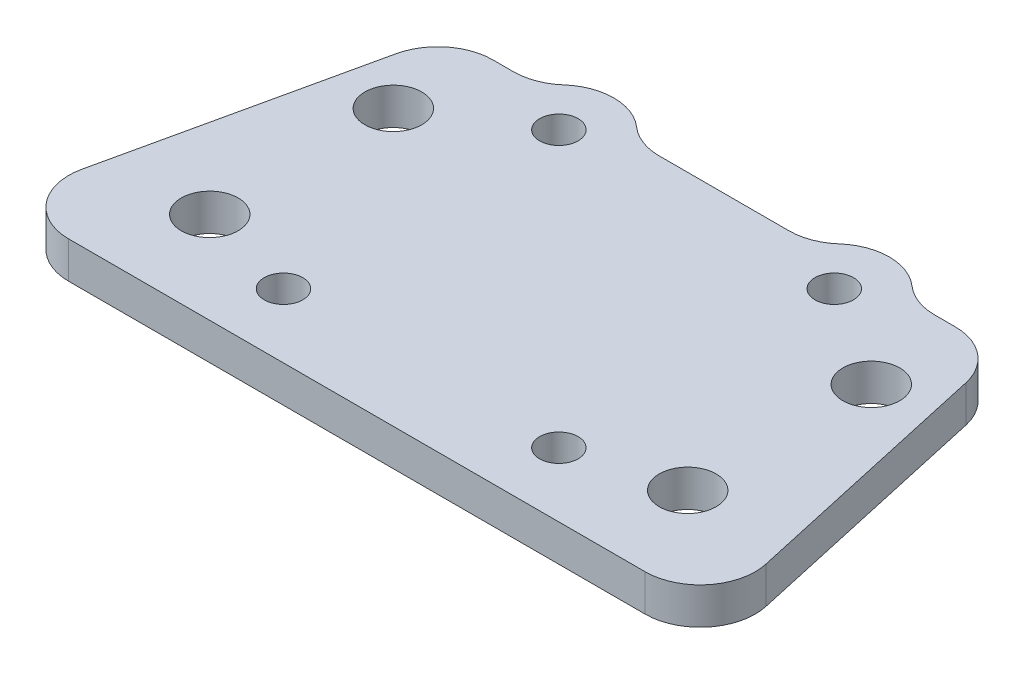
ISO-10303-21;
HEADER;
FILE_DESCRIPTION(('STEP AP214'),'2;1');
FILE_NAME('part.step','',(''),(''),'','','');
FILE_SCHEMA(('AUTOMOTIVE_DESIGN { 1 0 10303 214 1 1 1 1 }'));
ENDSEC;
DATA;
#1=APPLICATION_CONTEXT('core data for automotive mechanical design processes');
#2=APPLICATION_PROTOCOL_DEFINITION('international standard','automotive_design',2000,#1);
#3=PRODUCT_CONTEXT('',#1,'mechanical');
#4=PRODUCT('Part','Part','',(#3));
#5=PRODUCT_RELATED_PRODUCT_CATEGORY('part','',(#4));
#6=PRODUCT_DEFINITION_FORMATION('','',#4);
#7=PRODUCT_DEFINITION_CONTEXT('part definition',#1,'design');
#8=PRODUCT_DEFINITION('design','',#6,#7);
#9=PRODUCT_DEFINITION_SHAPE('','',#8);
#10=(LENGTH_UNIT() NAMED_UNIT(*) SI_UNIT(.MILLI.,.METRE.));
#11=(NAMED_UNIT(*) PLANE_ANGLE_UNIT() SI_UNIT($,.RADIAN.));
#12=(NAMED_UNIT(*) SI_UNIT($,.STERADIAN.) SOLID_ANGLE_UNIT());
#13=UNCERTAINTY_MEASURE_WITH_UNIT(LENGTH_MEASURE(1.E-05),#10,'distance_accuracy_value','');
#14=(GEOMETRIC_REPRESENTATION_CONTEXT(3) GLOBAL_UNCERTAINTY_ASSIGNED_CONTEXT((#13)) GLOBAL_UNIT_ASSIGNED_CONTEXT((#10,
#11,#12)) REPRESENTATION_CONTEXT('',''));
#15=CARTESIAN_POINT('',(0.,0.,0.));
#16=DIRECTION('',(0.,0.,1.));
#17=DIRECTION('',(1.,0.,0.));
#18=AXIS2_PLACEMENT_3D('',#15,#16,#17);
#19=CARTESIAN_POINT('',(0.,2.,-10.));
#20=DIRECTION('',(0.,0.,1.));
#21=DIRECTION('',(1.,0.,0.));
#22=AXIS2_PLACEMENT_3D('',#19,#20,#21);
#23=PLANE('',#22);
#24=DIRECTION('',(-1.,0.,0.));
#25=VECTOR('',#24,1.);
#26=CARTESIAN_POINT('',(0.,2.,-10.));
#27=LINE('',#26,#25);
#28=CARTESIAN_POINT('',(3.53137303340311,2.,-10.));
#29=VERTEX_POINT('',#28);
#30=CARTESIAN_POINT('',(-3.53137303340312,2.,-10.));
#31=VERTEX_POINT('',#30);
#32=EDGE_CURVE('E194',#29,#31,#27,.T.);
#33=ORIENTED_EDGE('',*,*,#32,.F.);
#34=DIRECTION('',(0.,1.,0.));
#35=VECTOR('',#34,1.);
#36=CARTESIAN_POINT('',(3.53137303340311,2.,-10.));
#37=LINE('',#36,#35);
#38=CARTESIAN_POINT('',(3.53137303340311,0.,-10.));
#39=VERTEX_POINT('',#38);
#40=EDGE_CURVE('E255',#29,#39,#37,.F.);
#41=ORIENTED_EDGE('',*,*,#40,.T.);
#42=DIRECTION('',(-1.,0.,0.));
#43=VECTOR('',#42,1.);
#44=CARTESIAN_POINT('',(0.,0.,-10.));
#45=LINE('',#44,#43);
#46=CARTESIAN_POINT('',(-3.53137303340312,0.,-10.));
#47=VERTEX_POINT('',#46);
#48=EDGE_CURVE('E289',#39,#47,#45,.T.);
#49=ORIENTED_EDGE('',*,*,#48,.T.);
#50=DIRECTION('',(0.,1.,0.));
#51=VECTOR('',#50,1.);
#52=CARTESIAN_POINT('',(-3.53137303340312,2.,-10.));
#53=LINE('',#52,#51);
#54=EDGE_CURVE('E251',#47,#31,#53,.T.);
#55=ORIENTED_EDGE('',*,*,#54,.T.);
#56=EDGE_LOOP('',(#33,#41,#49,#55));
#57=FACE_BOUND('',#56,.T.);
#58=ADVANCED_FACE('F47',(#57),#23,.F.);
#59=CARTESIAN_POINT('',(12.5926904073647,0.,-10.));
#60=VERTEX_POINT('',#59);
#61=CARTESIAN_POINT('',(11.4686269665969,0.,-10.));
#62=VERTEX_POINT('',#61);
#63=EDGE_CURVE('E164',#60,#62,#45,.T.);
#64=ORIENTED_EDGE('',*,*,#63,.T.);
#65=DIRECTION('',(0.,1.,0.));
#66=VECTOR('',#65,1.);
#67=CARTESIAN_POINT('',(11.4686269665969,2.,-10.));
#68=LINE('',#67,#66);
#69=CARTESIAN_POINT('',(11.4686269665969,2.,-10.));
#70=VERTEX_POINT('',#69);
#71=EDGE_CURVE('E240',#62,#70,#68,.T.);
#72=ORIENTED_EDGE('',*,*,#71,.T.);
#73=CARTESIAN_POINT('',(12.5926904073647,2.,-10.));
#74=VERTEX_POINT('',#73);
#75=EDGE_CURVE('E188',#74,#70,#27,.T.);
#76=ORIENTED_EDGE('',*,*,#75,.F.);
#77=DIRECTION('',(0.,-1.,0.));
#78=VECTOR('',#77,1.);
#79=CARTESIAN_POINT('',(12.5926904073647,0.,-10.));
#80=LINE('',#79,#78);
#81=EDGE_CURVE('E233',#74,#60,#80,.T.);
#82=ORIENTED_EDGE('',*,*,#81,.T.);
#83=EDGE_LOOP('',(#64,#72,#76,#82));
#84=FACE_BOUND('',#83,.T.);
#85=ADVANCED_FACE('F433',(#84),#23,.F.);
#86=CARTESIAN_POINT('',(-16.410890604518,2.,-3.6413136365179));
#87=DIRECTION('',(0.976256937653027,0.,0.216615769703717));
#88=DIRECTION('',(0.216615769703717,0.,-0.976256937653027));
#89=AXIS2_PLACEMENT_3D('',#86,#87,#88);
#90=PLANE('',#89);
#91=DIRECTION('',(-0.216615769703717,0.,0.976256937653027));
#92=VECTOR('',#91,1.);
#93=CARTESIAN_POINT('',(-16.410890604518,0.,-3.6413136365179));
#94=LINE('',#93,#92);
#95=CARTESIAN_POINT('',(-15.5214612203238,0.,-7.64984730911115));
#96=VERTEX_POINT('',#95);
#97=CARTESIAN_POINT('',(-18.6278368668238,0.,6.35015269088885));
#98=VERTEX_POINT('',#97);
#99=EDGE_CURVE('E383',#96,#98,#94,.T.);
#100=ORIENTED_EDGE('',*,*,#99,.T.);
#101=DIRECTION('',(0.,-1.,0.));
#102=VECTOR('',#101,1.);
#103=CARTESIAN_POINT('',(-18.6278368668238,2.,6.35015269088885));
#104=LINE('',#103,#102);
#105=CARTESIAN_POINT('',(-18.6278368668238,2.,6.35015269088885));
#106=VERTEX_POINT('',#105);
#107=EDGE_CURVE('E230',#98,#106,#104,.F.);
#108=ORIENTED_EDGE('',*,*,#107,.T.);
#109=DIRECTION('',(-0.216615769703717,0.,0.976256937653027));
#110=VECTOR('',#109,1.);
#111=CARTESIAN_POINT('',(-16.410890604518,2.,-3.6413136365179));
#112=LINE('',#111,#110);
#113=CARTESIAN_POINT('',(-15.5214612203238,2.,-7.64984730911115));
#114=VERTEX_POINT('',#113);
#115=EDGE_CURVE('E387',#114,#106,#112,.T.);
#116=ORIENTED_EDGE('',*,*,#115,.F.);
#117=DIRECTION('',(0.,-1.,0.));
#118=VECTOR('',#117,1.);
#119=CARTESIAN_POINT('',(-15.5214612203238,2.,-7.64984730911115));
#120=LINE('',#119,#118);
#121=EDGE_CURVE('E226',#114,#96,#120,.T.);
#122=ORIENTED_EDGE('',*,*,#121,.T.);
#123=EDGE_LOOP('',(#100,#108,#116,#122));
#124=FACE_BOUND('',#123,.T.);
#125=ADVANCED_FACE('F417',(#124),#90,.F.);
#126=CARTESIAN_POINT('',(0.,2.,10.));
#127=DIRECTION('',(0.,0.,-1.));
#128=DIRECTION('',(-1.,0.,0.));
#129=AXIS2_PLACEMENT_3D('',#126,#127,#128);
#130=PLANE('',#129);
#131=DIRECTION('',(1.,0.,0.));
#132=VECTOR('',#131,1.);
#133=CARTESIAN_POINT('',(0.,0.,10.));
#134=LINE('',#133,#132);
#135=CARTESIAN_POINT('',(-15.6990660538648,0.,10.));
#136=VERTEX_POINT('',#135);
#137=CARTESIAN_POINT('',(15.6990660538647,0.,10.));
#138=VERTEX_POINT('',#137);
#139=EDGE_CURVE('E182',#136,#138,#134,.T.);
#140=ORIENTED_EDGE('',*,*,#139,.T.);
#141=DIRECTION('',(0.,-1.,0.));
#142=VECTOR('',#141,1.);
#143=CARTESIAN_POINT('',(15.6990660538647,2.,10.));
#144=LINE('',#143,#142);
#145=CARTESIAN_POINT('',(15.6990660538647,2.,10.));
#146=VERTEX_POINT('',#145);
#147=EDGE_CURVE('E212',#138,#146,#144,.F.);
#148=ORIENTED_EDGE('',*,*,#147,.T.);
#149=DIRECTION('',(1.,0.,0.));
#150=VECTOR('',#149,1.);
#151=CARTESIAN_POINT('',(0.,2.,10.));
#152=LINE('',#151,#150);
#153=CARTESIAN_POINT('',(-15.6990660538648,2.,10.));
#154=VERTEX_POINT('',#153);
#155=EDGE_CURVE('E391',#154,#146,#152,.T.);
#156=ORIENTED_EDGE('',*,*,#155,.F.);
#157=DIRECTION('',(0.,-1.,0.));
#158=VECTOR('',#157,1.);
#159=CARTESIAN_POINT('',(-15.6990660538648,2.,10.));
#160=LINE('',#159,#158);
#161=EDGE_CURVE('E208',#154,#136,#160,.T.);
#162=ORIENTED_EDGE('',*,*,#161,.T.);
#163=EDGE_LOOP('',(#140,#148,#156,#162));
#164=FACE_BOUND('',#163,.T.);
#165=ADVANCED_FACE('F405',(#164),#130,.F.);
#166=CARTESIAN_POINT('',(16.410890604518,2.,-3.64131363651789));
#167=DIRECTION('',(0.976256937653027,0.,-0.216615769703717));
#168=DIRECTION('',(-0.216615769703717,0.,-0.976256937653027));
#169=AXIS2_PLACEMENT_3D('',#166,#167,#168);
#170=PLANE('',#169);
#171=DIRECTION('',(0.216615769703717,0.,0.976256937653027));
#172=VECTOR('',#171,1.);
#173=CARTESIAN_POINT('',(16.410890604518,2.,-3.64131363651789));
#174=LINE('',#173,#172);
#175=CARTESIAN_POINT('',(15.5214612203238,2.,-7.64984730911115));
#176=VERTEX_POINT('',#175);
#177=CARTESIAN_POINT('',(18.6278368668238,2.,6.35015269088885));
#178=VERTEX_POINT('',#177);
#179=EDGE_CURVE('E394',#176,#178,#174,.T.);
#180=ORIENTED_EDGE('',*,*,#179,.T.);
#181=DIRECTION('',(0.,-1.,0.));
#182=VECTOR('',#181,1.);
#183=CARTESIAN_POINT('',(18.6278368668238,0.,6.35015269088885));
#184=LINE('',#183,#182);
#185=CARTESIAN_POINT('',(18.6278368668238,0.,6.35015269088885));
#186=VERTEX_POINT('',#185);
#187=EDGE_CURVE('E171',#178,#186,#184,.T.);
#188=ORIENTED_EDGE('',*,*,#187,.T.);
#189=DIRECTION('',(0.216615769703717,0.,0.976256937653027));
#190=VECTOR('',#189,1.);
#191=CARTESIAN_POINT('',(16.410890604518,0.,-3.64131363651789));
#192=LINE('',#191,#190);
#193=CARTESIAN_POINT('',(15.5214612203238,0.,-7.64984730911115));
#194=VERTEX_POINT('',#193);
#195=EDGE_CURVE('E162',#194,#186,#192,.T.);
#196=ORIENTED_EDGE('',*,*,#195,.F.);
#197=DIRECTION('',(0.,-1.,0.));
#198=VECTOR('',#197,1.);
#199=CARTESIAN_POINT('',(15.5214612203238,2.,-7.64984730911115));
#200=LINE('',#199,#198);
#201=EDGE_CURVE('E177',#194,#176,#200,.F.);
#202=ORIENTED_EDGE('',*,*,#201,.T.);
#203=EDGE_LOOP('',(#180,#188,#196,#202));
#204=FACE_BOUND('',#203,.T.);
#205=ADVANCED_FACE('F176',(#204),#170,.T.);
#206=CARTESIAN_POINT('',(-11.4686269665969,2.,-10.));
#207=VERTEX_POINT('',#206);
#208=CARTESIAN_POINT('',(-12.5926904073647,2.,-10.));
#209=VERTEX_POINT('',#208);
#210=EDGE_CURVE('E196',#207,#209,#27,.T.);
#211=ORIENTED_EDGE('',*,*,#210,.F.);
#212=DIRECTION('',(0.,1.,0.));
#213=VECTOR('',#212,1.);
#214=CARTESIAN_POINT('',(-11.4686269665969,2.,-10.));
#215=LINE('',#214,#213);
#216=CARTESIAN_POINT('',(-11.4686269665969,0.,-10.));
#217=VERTEX_POINT('',#216);
#218=EDGE_CURVE('E63',#207,#217,#215,.F.);
#219=ORIENTED_EDGE('',*,*,#218,.T.);
#220=CARTESIAN_POINT('',(-12.5926904073647,0.,-10.));
#221=VERTEX_POINT('',#220);
#222=EDGE_CURVE('E181',#217,#221,#45,.T.);
#223=ORIENTED_EDGE('',*,*,#222,.T.);
#224=DIRECTION('',(0.,-1.,0.));
#225=VECTOR('',#224,1.);
#226=CARTESIAN_POINT('',(-12.5926904073647,2.,-10.));
#227=LINE('',#226,#225);
#228=EDGE_CURVE('E236',#221,#209,#227,.F.);
#229=ORIENTED_EDGE('',*,*,#228,.T.);
#230=EDGE_LOOP('',(#211,#219,#223,#229));
#231=FACE_BOUND('',#230,.T.);
#232=ADVANCED_FACE('F435',(#231),#23,.F.);
#233=CARTESIAN_POINT('',(0.,2.,0.));
#234=DIRECTION('',(0.,1.,0.));
#235=DIRECTION('',(0.,0.,1.));
#236=AXIS2_PLACEMENT_3D('',#233,#234,#235);
#237=PLANE('',#236);
#238=CARTESIAN_POINT('',(7.5,2.,-8.5));
#239=DIRECTION('',(0.,1.,0.));
#240=DIRECTION('',(0.,0.,1.));
#241=AXIS2_PLACEMENT_3D('',#238,#239,#240);
#242=CIRCLE('',#241,1.05);
#243=CARTESIAN_POINT('',(7.5,2.,-7.45));
#244=VERTEX_POINT('',#243);
#245=EDGE_CURVE('E340',#244,#244,#242,.T.);
#246=ORIENTED_EDGE('',*,*,#245,.F.);
#247=EDGE_LOOP('',(#246));
#248=FACE_BOUND('',#247,.T.);
#249=CARTESIAN_POINT('',(7.5,2.,6.5));
#250=DIRECTION('',(0.,1.,0.));
#251=DIRECTION('',(0.,0.,1.));
#252=AXIS2_PLACEMENT_3D('',#249,#250,#251);
#253=CIRCLE('',#252,1.05);
#254=CARTESIAN_POINT('',(7.5,2.,7.55));
#255=VERTEX_POINT('',#254);
#256=EDGE_CURVE('E332',#255,#255,#253,.T.);
#257=ORIENTED_EDGE('',*,*,#256,.F.);
#258=EDGE_LOOP('',(#257));
#259=FACE_BOUND('',#258,.T.);
#260=CARTESIAN_POINT('',(-7.5,2.,6.5));
#261=DIRECTION('',(0.,1.,0.));
#262=DIRECTION('',(0.,0.,1.));
#263=AXIS2_PLACEMENT_3D('',#260,#261,#262);
#264=CIRCLE('',#263,1.05);
#265=CARTESIAN_POINT('',(-7.5,2.,7.55));
#266=VERTEX_POINT('',#265);
#267=EDGE_CURVE('E323',#266,#266,#264,.T.);
#268=ORIENTED_EDGE('',*,*,#267,.F.);
#269=EDGE_LOOP('',(#268));
#270=FACE_BOUND('',#269,.T.);
#271=CARTESIAN_POINT('',(-7.5,2.,-8.5));
#272=DIRECTION('',(0.,1.,0.));
#273=DIRECTION('',(0.,0.,1.));
#274=AXIS2_PLACEMENT_3D('',#271,#272,#273);
#275=CIRCLE('',#274,1.05);
#276=CARTESIAN_POINT('',(-7.5,2.,-7.45));
#277=VERTEX_POINT('',#276);
#278=EDGE_CURVE('E327',#277,#277,#275,.T.);
#279=ORIENTED_EDGE('',*,*,#278,.F.);
#280=EDGE_LOOP('',(#279));
#281=FACE_BOUND('',#280,.T.);
#282=CARTESIAN_POINT('',(13.0180101702094,2.,-5.));
#283=DIRECTION('',(0.,1.,0.));
#284=DIRECTION('',(0.,0.,-1.));
#285=AXIS2_PLACEMENT_3D('',#282,#283,#284);
#286=CIRCLE('',#285,1.55);
#287=CARTESIAN_POINT('',(13.0180101702094,2.,-6.55));
#288=VERTEX_POINT('',#287);
#289=EDGE_CURVE('E372',#288,#288,#286,.T.);
#290=ORIENTED_EDGE('',*,*,#289,.F.);
#291=EDGE_LOOP('',(#290));
#292=FACE_BOUND('',#291,.T.);
#293=CARTESIAN_POINT('',(13.0180101702094,2.,5.));
#294=DIRECTION('',(0.,1.,0.));
#295=DIRECTION('',(0.,0.,-1.));
#296=AXIS2_PLACEMENT_3D('',#293,#294,#295);
#297=CIRCLE('',#296,1.55);
#298=CARTESIAN_POINT('',(13.0180101702094,2.,3.45));
#299=VERTEX_POINT('',#298);
#300=EDGE_CURVE('E364',#299,#299,#297,.T.);
#301=ORIENTED_EDGE('',*,*,#300,.F.);
#302=EDGE_LOOP('',(#301));
#303=FACE_BOUND('',#302,.T.);
#304=CARTESIAN_POINT('',(-13.0180101702094,2.,5.));
#305=DIRECTION('',(0.,1.,0.));
#306=DIRECTION('',(0.,0.,1.));
#307=AXIS2_PLACEMENT_3D('',#304,#305,#306);
#308=CIRCLE('',#307,1.55);
#309=CARTESIAN_POINT('',(-13.0180101702094,2.,6.55));
#310=VERTEX_POINT('',#309);
#311=EDGE_CURVE('E355',#310,#310,#308,.T.);
#312=ORIENTED_EDGE('',*,*,#311,.F.);
#313=EDGE_LOOP('',(#312));
#314=FACE_BOUND('',#313,.T.);
#315=CARTESIAN_POINT('',(-13.0180101702094,2.,-5.));
#316=DIRECTION('',(0.,1.,0.));
#317=DIRECTION('',(0.,0.,1.));
#318=AXIS2_PLACEMENT_3D('',#315,#316,#317);
#319=CIRCLE('',#318,1.55);
#320=CARTESIAN_POINT('',(-13.0180101702094,2.,-3.45));
#321=VERTEX_POINT('',#320);
#322=EDGE_CURVE('E359',#321,#321,#319,.T.);
#323=ORIENTED_EDGE('',*,*,#322,.F.);
#324=EDGE_LOOP('',(#323));
#325=FACE_BOUND('',#324,.T.);
#326=ORIENTED_EDGE('',*,*,#155,.T.);
#327=CARTESIAN_POINT('',(15.6990660538647,2.,7.));
#328=DIRECTION('',(0.,1.,0.));
#329=DIRECTION('',(0.,0.,1.));
#330=AXIS2_PLACEMENT_3D('',#327,#328,#329);
#331=CIRCLE('',#330,3.);
#332=EDGE_CURVE('E223',#146,#178,#331,.T.);
#333=ORIENTED_EDGE('',*,*,#332,.T.);
#334=ORIENTED_EDGE('',*,*,#179,.F.);
#335=CARTESIAN_POINT('',(12.5926904073647,2.,-7.));
#336=DIRECTION('',(0.,1.,0.));
#337=DIRECTION('',(0.,0.,1.));
#338=AXIS2_PLACEMENT_3D('',#335,#336,#337);
#339=CIRCLE('',#338,3.);
#340=EDGE_CURVE('E186',#176,#74,#339,.T.);
#341=ORIENTED_EDGE('',*,*,#340,.T.);
#342=ORIENTED_EDGE('',*,*,#75,.T.);
#343=CARTESIAN_POINT('',(11.4686269665969,2.,-13.));
#344=DIRECTION('',(0.,1.,0.));
#345=DIRECTION('',(0.,0.,1.));
#346=AXIS2_PLACEMENT_3D('',#343,#344,#345);
#347=CIRCLE('',#346,3.);
#348=CARTESIAN_POINT('',(9.48431348329844,2.,-10.75));
#349=VERTEX_POINT('',#348);
#350=EDGE_CURVE('E267',#70,#349,#347,.F.);
#351=ORIENTED_EDGE('',*,*,#350,.T.);
#352=CARTESIAN_POINT('',(7.5,2.,-8.5));
#353=DIRECTION('',(0.,1.,0.));
#354=DIRECTION('',(0.,0.,1.));
#355=AXIS2_PLACEMENT_3D('',#352,#353,#354);
#356=CIRCLE('',#355,3.);
#357=CARTESIAN_POINT('',(5.51568651670155,2.,-10.75));
#358=VERTEX_POINT('',#357);
#359=EDGE_CURVE('E317',#349,#358,#356,.T.);
#360=ORIENTED_EDGE('',*,*,#359,.T.);
#361=CARTESIAN_POINT('',(3.53137303340311,2.,-13.));
#362=DIRECTION('',(0.,1.,0.));
#363=DIRECTION('',(0.,0.,1.));
#364=AXIS2_PLACEMENT_3D('',#361,#362,#363);
#365=CIRCLE('',#364,3.);
#366=EDGE_CURVE('E273',#358,#29,#365,.F.);
#367=ORIENTED_EDGE('',*,*,#366,.T.);
#368=ORIENTED_EDGE('',*,*,#32,.T.);
#369=CARTESIAN_POINT('',(-3.53137303340312,2.,-13.));
#370=DIRECTION('',(0.,1.,0.));
#371=DIRECTION('',(0.,0.,1.));
#372=AXIS2_PLACEMENT_3D('',#369,#370,#371);
#373=CIRCLE('',#372,3.);
#374=CARTESIAN_POINT('',(-5.51568651670156,2.,-10.75));
#375=VERTEX_POINT('',#374);
#376=EDGE_CURVE('E279',#31,#375,#373,.F.);
#377=ORIENTED_EDGE('',*,*,#376,.T.);
#378=CARTESIAN_POINT('',(-7.5,2.,-8.5));
#379=DIRECTION('',(0.,1.,0.));
#380=DIRECTION('',(0.,0.,1.));
#381=AXIS2_PLACEMENT_3D('',#378,#379,#380);
#382=CIRCLE('',#381,3.);
#383=CARTESIAN_POINT('',(-9.48431348329844,2.,-10.75));
#384=VERTEX_POINT('',#383);
#385=EDGE_CURVE('E305',#375,#384,#382,.T.);
#386=ORIENTED_EDGE('',*,*,#385,.T.);
#387=CARTESIAN_POINT('',(-11.4686269665969,2.,-13.));
#388=DIRECTION('',(0.,1.,0.));
#389=DIRECTION('',(0.,0.,1.));
#390=AXIS2_PLACEMENT_3D('',#387,#388,#389);
#391=CIRCLE('',#390,3.);
#392=EDGE_CURVE('E56',#384,#207,#391,.F.);
#393=ORIENTED_EDGE('',*,*,#392,.T.);
#394=ORIENTED_EDGE('',*,*,#210,.T.);
#395=CARTESIAN_POINT('',(-12.5926904073647,2.,-7.));
#396=DIRECTION('',(0.,1.,0.));
#397=DIRECTION('',(0.,0.,1.));
#398=AXIS2_PLACEMENT_3D('',#395,#396,#397);
#399=CIRCLE('',#398,3.);
#400=EDGE_CURVE('E217',#209,#114,#399,.T.);
#401=ORIENTED_EDGE('',*,*,#400,.T.);
#402=ORIENTED_EDGE('',*,*,#115,.T.);
#403=CARTESIAN_POINT('',(-15.6990660538648,2.,7.));
#404=DIRECTION('',(0.,1.,0.));
#405=DIRECTION('',(0.,0.,1.));
#406=AXIS2_PLACEMENT_3D('',#403,#404,#405);
#407=CIRCLE('',#406,3.);
#408=EDGE_CURVE('E220',#106,#154,#407,.T.);
#409=ORIENTED_EDGE('',*,*,#408,.T.);
#410=EDGE_LOOP('',(#326,#333,#334,#341,#342,#351,#360,#367,#368,#377,#386,#393,#394,#401,#402,#409));
#411=FACE_BOUND('',#410,.T.);
#412=ADVANCED_FACE('F304',(#248,#259,#270,#281,#292,#303,#314,#325,#411),#237,.T.);
#413=CARTESIAN_POINT('',(0.,0.,0.));
#414=DIRECTION('',(0.,1.,0.));
#415=DIRECTION('',(0.,0.,1.));
#416=AXIS2_PLACEMENT_3D('',#413,#414,#415);
#417=PLANE('',#416);
#418=CARTESIAN_POINT('',(7.5,0.,-8.5));
#419=DIRECTION('',(0.,1.,0.));
#420=DIRECTION('',(0.,0.,1.));
#421=AXIS2_PLACEMENT_3D('',#418,#419,#420);
#422=CIRCLE('',#421,1.05);
#423=CARTESIAN_POINT('',(7.5,0.,-7.45));
#424=VERTEX_POINT('',#423);
#425=EDGE_CURVE('E314',#424,#424,#422,.T.);
#426=ORIENTED_EDGE('',*,*,#425,.T.);
#427=EDGE_LOOP('',(#426));
#428=FACE_BOUND('',#427,.T.);
#429=CARTESIAN_POINT('',(7.5,0.,6.5));
#430=DIRECTION('',(0.,1.,0.));
#431=DIRECTION('',(0.,0.,1.));
#432=AXIS2_PLACEMENT_3D('',#429,#430,#431);
#433=CIRCLE('',#432,1.05);
#434=CARTESIAN_POINT('',(7.5,0.,7.55));
#435=VERTEX_POINT('',#434);
#436=EDGE_CURVE('E336',#435,#435,#433,.T.);
#437=ORIENTED_EDGE('',*,*,#436,.T.);
#438=EDGE_LOOP('',(#437));
#439=FACE_BOUND('',#438,.T.);
#440=CARTESIAN_POINT('',(-7.5,0.,6.5));
#441=DIRECTION('',(0.,1.,0.));
#442=DIRECTION('',(0.,0.,1.));
#443=AXIS2_PLACEMENT_3D('',#440,#441,#442);
#444=CIRCLE('',#443,1.05);
#445=CARTESIAN_POINT('',(-7.5,0.,7.55));
#446=VERTEX_POINT('',#445);
#447=EDGE_CURVE('E328',#446,#446,#444,.T.);
#448=ORIENTED_EDGE('',*,*,#447,.T.);
#449=EDGE_LOOP('',(#448));
#450=FACE_BOUND('',#449,.T.);
#451=CARTESIAN_POINT('',(-7.5,0.,-8.5));
#452=DIRECTION('',(0.,1.,0.));
#453=DIRECTION('',(0.,0.,1.));
#454=AXIS2_PLACEMENT_3D('',#451,#452,#453);
#455=CIRCLE('',#454,1.05);
#456=CARTESIAN_POINT('',(-7.5,0.,-7.45));
#457=VERTEX_POINT('',#456);
#458=EDGE_CURVE('E347',#457,#457,#455,.T.);
#459=ORIENTED_EDGE('',*,*,#458,.T.);
#460=EDGE_LOOP('',(#459));
#461=FACE_BOUND('',#460,.T.);
#462=CARTESIAN_POINT('',(13.0180101702094,0.,-5.));
#463=DIRECTION('',(0.,1.,0.));
#464=DIRECTION('',(0.,0.,-1.));
#465=AXIS2_PLACEMENT_3D('',#462,#463,#464);
#466=CIRCLE('',#465,1.55);
#467=CARTESIAN_POINT('',(13.0180101702094,0.,-6.55));
#468=VERTEX_POINT('',#467);
#469=EDGE_CURVE('E351',#468,#468,#466,.T.);
#470=ORIENTED_EDGE('',*,*,#469,.T.);
#471=EDGE_LOOP('',(#470));
#472=FACE_BOUND('',#471,.T.);
#473=CARTESIAN_POINT('',(13.0180101702094,0.,5.));
#474=DIRECTION('',(0.,1.,0.));
#475=DIRECTION('',(0.,0.,-1.));
#476=AXIS2_PLACEMENT_3D('',#473,#474,#475);
#477=CIRCLE('',#476,1.55);
#478=CARTESIAN_POINT('',(13.0180101702094,0.,3.45));
#479=VERTEX_POINT('',#478);
#480=EDGE_CURVE('E368',#479,#479,#477,.T.);
#481=ORIENTED_EDGE('',*,*,#480,.T.);
#482=EDGE_LOOP('',(#481));
#483=FACE_BOUND('',#482,.T.);
#484=CARTESIAN_POINT('',(-13.0180101702094,0.,5.));
#485=DIRECTION('',(0.,1.,0.));
#486=DIRECTION('',(0.,0.,1.));
#487=AXIS2_PLACEMENT_3D('',#484,#485,#486);
#488=CIRCLE('',#487,1.55);
#489=CARTESIAN_POINT('',(-13.0180101702094,0.,6.55));
#490=VERTEX_POINT('',#489);
#491=EDGE_CURVE('E360',#490,#490,#488,.T.);
#492=ORIENTED_EDGE('',*,*,#491,.T.);
#493=EDGE_LOOP('',(#492));
#494=FACE_BOUND('',#493,.T.);
#495=CARTESIAN_POINT('',(-13.0180101702094,0.,-5.));
#496=DIRECTION('',(0.,1.,0.));
#497=DIRECTION('',(0.,0.,1.));
#498=AXIS2_PLACEMENT_3D('',#495,#496,#497);
#499=CIRCLE('',#498,1.55);
#500=CARTESIAN_POINT('',(-13.0180101702094,0.,-3.45));
#501=VERTEX_POINT('',#500);
#502=EDGE_CURVE('E379',#501,#501,#499,.T.);
#503=ORIENTED_EDGE('',*,*,#502,.T.);
#504=EDGE_LOOP('',(#503));
#505=FACE_BOUND('',#504,.T.);
#506=ORIENTED_EDGE('',*,*,#195,.T.);
#507=CARTESIAN_POINT('',(15.6990660538647,0.,7.));
#508=DIRECTION('',(0.,1.,0.));
#509=DIRECTION('',(0.,0.,1.));
#510=AXIS2_PLACEMENT_3D('',#507,#508,#509);
#511=CIRCLE('',#510,3.);
#512=EDGE_CURVE('E205',#186,#138,#511,.F.);
#513=ORIENTED_EDGE('',*,*,#512,.T.);
#514=ORIENTED_EDGE('',*,*,#139,.F.);
#515=CARTESIAN_POINT('',(-15.6990660538648,0.,7.));
#516=DIRECTION('',(0.,1.,0.));
#517=DIRECTION('',(0.,0.,1.));
#518=AXIS2_PLACEMENT_3D('',#515,#516,#517);
#519=CIRCLE('',#518,3.);
#520=EDGE_CURVE('E202',#136,#98,#519,.F.);
#521=ORIENTED_EDGE('',*,*,#520,.T.);
#522=ORIENTED_EDGE('',*,*,#99,.F.);
#523=CARTESIAN_POINT('',(-12.5926904073647,0.,-7.));
#524=DIRECTION('',(0.,1.,0.));
#525=DIRECTION('',(0.,0.,1.));
#526=AXIS2_PLACEMENT_3D('',#523,#524,#525);
#527=CIRCLE('',#526,3.);
#528=EDGE_CURVE('E170',#96,#221,#527,.F.);
#529=ORIENTED_EDGE('',*,*,#528,.T.);
#530=ORIENTED_EDGE('',*,*,#222,.F.);
#531=CARTESIAN_POINT('',(-11.4686269665969,0.,-13.));
#532=DIRECTION('',(0.,1.,0.));
#533=DIRECTION('',(0.,0.,1.));
#534=AXIS2_PLACEMENT_3D('',#531,#532,#533);
#535=CIRCLE('',#534,3.);
#536=CARTESIAN_POINT('',(-9.48431348329844,0.,-10.75));
#537=VERTEX_POINT('',#536);
#538=EDGE_CURVE('E11',#217,#537,#535,.T.);
#539=ORIENTED_EDGE('',*,*,#538,.T.);
#540=CARTESIAN_POINT('',(-7.5,0.,-8.5));
#541=DIRECTION('',(0.,1.,0.));
#542=DIRECTION('',(0.,0.,1.));
#543=AXIS2_PLACEMENT_3D('',#540,#541,#542);
#544=CIRCLE('',#543,3.);
#545=CARTESIAN_POINT('',(-5.51568651670156,0.,-10.75));
#546=VERTEX_POINT('',#545);
#547=EDGE_CURVE('E292',#537,#546,#544,.F.);
#548=ORIENTED_EDGE('',*,*,#547,.T.);
#549=CARTESIAN_POINT('',(-3.53137303340312,0.,-13.));
#550=DIRECTION('',(0.,1.,0.));
#551=DIRECTION('',(0.,0.,1.));
#552=AXIS2_PLACEMENT_3D('',#549,#550,#551);
#553=CIRCLE('',#552,3.);
#554=EDGE_CURVE('E282',#546,#47,#553,.T.);
#555=ORIENTED_EDGE('',*,*,#554,.T.);
#556=ORIENTED_EDGE('',*,*,#48,.F.);
#557=CARTESIAN_POINT('',(3.53137303340311,0.,-13.));
#558=DIRECTION('',(0.,1.,0.));
#559=DIRECTION('',(0.,0.,1.));
#560=AXIS2_PLACEMENT_3D('',#557,#558,#559);
#561=CIRCLE('',#560,3.);
#562=CARTESIAN_POINT('',(5.51568651670155,0.,-10.75));
#563=VERTEX_POINT('',#562);
#564=EDGE_CURVE('E276',#39,#563,#561,.T.);
#565=ORIENTED_EDGE('',*,*,#564,.T.);
#566=CARTESIAN_POINT('',(7.5,0.,-8.5));
#567=DIRECTION('',(0.,1.,0.));
#568=DIRECTION('',(0.,0.,1.));
#569=AXIS2_PLACEMENT_3D('',#566,#567,#568);
#570=CIRCLE('',#569,3.);
#571=CARTESIAN_POINT('',(9.48431348329844,0.,-10.75));
#572=VERTEX_POINT('',#571);
#573=EDGE_CURVE('E310',#563,#572,#570,.F.);
#574=ORIENTED_EDGE('',*,*,#573,.T.);
#575=CARTESIAN_POINT('',(11.4686269665969,0.,-13.));
#576=DIRECTION('',(0.,1.,0.));
#577=DIRECTION('',(0.,0.,1.));
#578=AXIS2_PLACEMENT_3D('',#575,#576,#577);
#579=CIRCLE('',#578,3.);
#580=EDGE_CURVE('E270',#572,#62,#579,.T.);
#581=ORIENTED_EDGE('',*,*,#580,.T.);
#582=ORIENTED_EDGE('',*,*,#63,.F.);
#583=CARTESIAN_POINT('',(12.5926904073647,0.,-7.));
#584=DIRECTION('',(0.,1.,0.));
#585=DIRECTION('',(0.,0.,1.));
#586=AXIS2_PLACEMENT_3D('',#583,#584,#585);
#587=CIRCLE('',#586,3.);
#588=EDGE_CURVE('E159',#60,#194,#587,.F.);
#589=ORIENTED_EDGE('',*,*,#588,.T.);
#590=EDGE_LOOP('',(#506,#513,#514,#521,#522,#529,#530,#539,#548,#555,#556,#565,#574,#581,#582,#589));
#591=FACE_BOUND('',#590,.T.);
#592=ADVANCED_FACE('F161',(#428,#439,#450,#461,#472,#483,#494,#505,#591),#417,.F.);
#593=CARTESIAN_POINT('',(-13.0180101702094,0.,-5.));
#594=DIRECTION('',(0.,1.,0.));
#595=DIRECTION('',(0.,0.,1.));
#596=AXIS2_PLACEMENT_3D('',#593,#594,#595);
#597=CYLINDRICAL_SURFACE('',#596,1.55);
#598=ORIENTED_EDGE('',*,*,#502,.F.);
#599=EDGE_LOOP('',(#598));
#600=FACE_BOUND('',#599,.T.);
#601=ORIENTED_EDGE('',*,*,#322,.T.);
#602=EDGE_LOOP('',(#601));
#603=FACE_BOUND('',#602,.T.);
#604=ADVANCED_FACE('F559',(#600,#603),#597,.F.);
#605=CARTESIAN_POINT('',(-13.0180101702094,0.,5.));
#606=DIRECTION('',(0.,1.,0.));
#607=DIRECTION('',(0.,0.,1.));
#608=AXIS2_PLACEMENT_3D('',#605,#606,#607);
#609=CYLINDRICAL_SURFACE('',#608,1.55);
#610=ORIENTED_EDGE('',*,*,#491,.F.);
#611=EDGE_LOOP('',(#610));
#612=FACE_BOUND('',#611,.T.);
#613=ORIENTED_EDGE('',*,*,#311,.T.);
#614=EDGE_LOOP('',(#613));
#615=FACE_BOUND('',#614,.T.);
#616=ADVANCED_FACE('F619',(#612,#615),#609,.F.);
#617=CARTESIAN_POINT('',(13.0180101702094,0.,5.));
#618=DIRECTION('',(0.,1.,0.));
#619=DIRECTION('',(0.,0.,1.));
#620=AXIS2_PLACEMENT_3D('',#617,#618,#619);
#621=CYLINDRICAL_SURFACE('',#620,1.55);
#622=ORIENTED_EDGE('',*,*,#480,.F.);
#623=EDGE_LOOP('',(#622));
#624=FACE_BOUND('',#623,.T.);
#625=ORIENTED_EDGE('',*,*,#300,.T.);
#626=EDGE_LOOP('',(#625));
#627=FACE_BOUND('',#626,.T.);
#628=ADVANCED_FACE('F622',(#624,#627),#621,.F.);
#629=CARTESIAN_POINT('',(13.0180101702094,0.,-5.));
#630=DIRECTION('',(0.,1.,0.));
#631=DIRECTION('',(0.,0.,1.));
#632=AXIS2_PLACEMENT_3D('',#629,#630,#631);
#633=CYLINDRICAL_SURFACE('',#632,1.55);
#634=ORIENTED_EDGE('',*,*,#469,.F.);
#635=EDGE_LOOP('',(#634));
#636=FACE_BOUND('',#635,.T.);
#637=ORIENTED_EDGE('',*,*,#289,.T.);
#638=EDGE_LOOP('',(#637));
#639=FACE_BOUND('',#638,.T.);
#640=ADVANCED_FACE('F617',(#636,#639),#633,.F.);
#641=CARTESIAN_POINT('',(-7.5,0.,-8.5));
#642=DIRECTION('',(0.,1.,0.));
#643=DIRECTION('',(0.,0.,1.));
#644=AXIS2_PLACEMENT_3D('',#641,#642,#643);
#645=CYLINDRICAL_SURFACE('',#644,1.05);
#646=ORIENTED_EDGE('',*,*,#458,.F.);
#647=EDGE_LOOP('',(#646));
#648=FACE_BOUND('',#647,.T.);
#649=ORIENTED_EDGE('',*,*,#278,.T.);
#650=EDGE_LOOP('',(#649));
#651=FACE_BOUND('',#650,.T.);
#652=ADVANCED_FACE('F608',(#648,#651),#645,.F.);
#653=CARTESIAN_POINT('',(-7.5,0.,6.5));
#654=DIRECTION('',(0.,1.,0.));
#655=DIRECTION('',(0.,0.,1.));
#656=AXIS2_PLACEMENT_3D('',#653,#654,#655);
#657=CYLINDRICAL_SURFACE('',#656,1.05);
#658=ORIENTED_EDGE('',*,*,#447,.F.);
#659=EDGE_LOOP('',(#658));
#660=FACE_BOUND('',#659,.T.);
#661=ORIENTED_EDGE('',*,*,#267,.T.);
#662=EDGE_LOOP('',(#661));
#663=FACE_BOUND('',#662,.T.);
#664=ADVANCED_FACE('F604',(#660,#663),#657,.F.);
#665=CARTESIAN_POINT('',(7.5,0.,6.5));
#666=DIRECTION('',(0.,1.,0.));
#667=DIRECTION('',(0.,0.,1.));
#668=AXIS2_PLACEMENT_3D('',#665,#666,#667);
#669=CYLINDRICAL_SURFACE('',#668,1.05);
#670=ORIENTED_EDGE('',*,*,#436,.F.);
#671=EDGE_LOOP('',(#670));
#672=FACE_BOUND('',#671,.T.);
#673=ORIENTED_EDGE('',*,*,#256,.T.);
#674=EDGE_LOOP('',(#673));
#675=FACE_BOUND('',#674,.T.);
#676=ADVANCED_FACE('F607',(#672,#675),#669,.F.);
#677=CARTESIAN_POINT('',(7.5,0.,-8.5));
#678=DIRECTION('',(0.,1.,0.));
#679=DIRECTION('',(0.,0.,1.));
#680=AXIS2_PLACEMENT_3D('',#677,#678,#679);
#681=CYLINDRICAL_SURFACE('',#680,1.05);
#682=ORIENTED_EDGE('',*,*,#425,.F.);
#683=EDGE_LOOP('',(#682));
#684=FACE_BOUND('',#683,.T.);
#685=ORIENTED_EDGE('',*,*,#245,.T.);
#686=EDGE_LOOP('',(#685));
#687=FACE_BOUND('',#686,.T.);
#688=ADVANCED_FACE('F479',(#684,#687),#681,.F.);
#689=CARTESIAN_POINT('',(15.6990660538647,2.,7.));
#690=DIRECTION('',(0.,1.,0.));
#691=DIRECTION('',(0.,0.,1.));
#692=AXIS2_PLACEMENT_3D('',#689,#690,#691);
#693=CYLINDRICAL_SURFACE('',#692,3.);
#694=ORIENTED_EDGE('',*,*,#332,.F.);
#695=ORIENTED_EDGE('',*,*,#147,.F.);
#696=ORIENTED_EDGE('',*,*,#512,.F.);
#697=ORIENTED_EDGE('',*,*,#187,.F.);
#698=EDGE_LOOP('',(#694,#695,#696,#697));
#699=FACE_BOUND('',#698,.T.);
#700=ADVANCED_FACE('F410',(#699),#693,.T.);
#701=CARTESIAN_POINT('',(-15.6990660538648,2.,7.));
#702=DIRECTION('',(0.,-1.,0.));
#703=DIRECTION('',(0.,0.,-1.));
#704=AXIS2_PLACEMENT_3D('',#701,#702,#703);
#705=CYLINDRICAL_SURFACE('',#704,3.);
#706=ORIENTED_EDGE('',*,*,#408,.F.);
#707=ORIENTED_EDGE('',*,*,#107,.F.);
#708=ORIENTED_EDGE('',*,*,#520,.F.);
#709=ORIENTED_EDGE('',*,*,#161,.F.);
#710=EDGE_LOOP('',(#706,#707,#708,#709));
#711=FACE_BOUND('',#710,.T.);
#712=ADVANCED_FACE('F413',(#711),#705,.T.);
#713=CARTESIAN_POINT('',(-12.5926904073647,2.,-7.));
#714=DIRECTION('',(0.,-1.,0.));
#715=DIRECTION('',(0.,0.,-1.));
#716=AXIS2_PLACEMENT_3D('',#713,#714,#715);
#717=CYLINDRICAL_SURFACE('',#716,3.);
#718=ORIENTED_EDGE('',*,*,#400,.F.);
#719=ORIENTED_EDGE('',*,*,#228,.F.);
#720=ORIENTED_EDGE('',*,*,#528,.F.);
#721=ORIENTED_EDGE('',*,*,#121,.F.);
#722=EDGE_LOOP('',(#718,#719,#720,#721));
#723=FACE_BOUND('',#722,.T.);
#724=ADVANCED_FACE('F422',(#723),#717,.T.);
#725=CARTESIAN_POINT('',(12.5926904073647,2.,-7.));
#726=DIRECTION('',(0.,1.,0.));
#727=DIRECTION('',(0.,0.,1.));
#728=AXIS2_PLACEMENT_3D('',#725,#726,#727);
#729=CYLINDRICAL_SURFACE('',#728,3.);
#730=ORIENTED_EDGE('',*,*,#340,.F.);
#731=ORIENTED_EDGE('',*,*,#201,.F.);
#732=ORIENTED_EDGE('',*,*,#588,.F.);
#733=ORIENTED_EDGE('',*,*,#81,.F.);
#734=EDGE_LOOP('',(#730,#731,#732,#733));
#735=FACE_BOUND('',#734,.T.);
#736=ADVANCED_FACE('F185',(#735),#729,.T.);
#737=CARTESIAN_POINT('',(7.5,-5.40832691319598,-8.5));
#738=DIRECTION('',(0.,1.,0.));
#739=DIRECTION('',(0.,0.,1.));
#740=AXIS2_PLACEMENT_3D('',#737,#738,#739);
#741=CYLINDRICAL_SURFACE('',#740,3.);
#742=ORIENTED_EDGE('',*,*,#359,.F.);
#743=DIRECTION('',(0.,1.,0.));
#744=VECTOR('',#743,1.);
#745=CARTESIAN_POINT('',(9.48431348329844,-5.40832691319598,-10.75));
#746=LINE('',#745,#744);
#747=EDGE_CURVE('E248',#349,#572,#746,.F.);
#748=ORIENTED_EDGE('',*,*,#747,.T.);
#749=ORIENTED_EDGE('',*,*,#573,.F.);
#750=DIRECTION('',(0.,1.,0.));
#751=VECTOR('',#750,1.);
#752=CARTESIAN_POINT('',(5.51568651670155,-5.40832691319598,-10.75));
#753=LINE('',#752,#751);
#754=EDGE_CURVE('E244',#563,#358,#753,.T.);
#755=ORIENTED_EDGE('',*,*,#754,.T.);
#756=EDGE_LOOP('',(#742,#748,#749,#755));
#757=FACE_BOUND('',#756,.T.);
#758=ADVANCED_FACE('F461',(#757),#741,.T.);
#759=CARTESIAN_POINT('',(-7.5,-5.40832691319598,-8.5));
#760=DIRECTION('',(0.,1.,0.));
#761=DIRECTION('',(0.,0.,1.));
#762=AXIS2_PLACEMENT_3D('',#759,#760,#761);
#763=CYLINDRICAL_SURFACE('',#762,3.);
#764=ORIENTED_EDGE('',*,*,#385,.F.);
#765=DIRECTION('',(0.,1.,0.));
#766=VECTOR('',#765,1.);
#767=CARTESIAN_POINT('',(-5.51568651670156,-5.40832691319598,-10.75));
#768=LINE('',#767,#766);
#769=EDGE_CURVE('E262',#375,#546,#768,.F.);
#770=ORIENTED_EDGE('',*,*,#769,.T.);
#771=ORIENTED_EDGE('',*,*,#547,.F.);
#772=DIRECTION('',(0.,1.,0.));
#773=VECTOR('',#772,1.);
#774=CARTESIAN_POINT('',(-9.48431348329844,-5.40832691319598,-10.75));
#775=LINE('',#774,#773);
#776=EDGE_CURVE('E258',#537,#384,#775,.T.);
#777=ORIENTED_EDGE('',*,*,#776,.T.);
#778=EDGE_LOOP('',(#764,#770,#771,#777));
#779=FACE_BOUND('',#778,.T.);
#780=ADVANCED_FACE('F307',(#779),#763,.T.);
#781=CARTESIAN_POINT('',(11.4686269665969,-5.40832691319598,-13.));
#782=DIRECTION('',(0.,1.,0.));
#783=DIRECTION('',(0.,0.,1.));
#784=AXIS2_PLACEMENT_3D('',#781,#782,#783);
#785=CYLINDRICAL_SURFACE('',#784,3.);
#786=ORIENTED_EDGE('',*,*,#580,.F.);
#787=ORIENTED_EDGE('',*,*,#747,.F.);
#788=ORIENTED_EDGE('',*,*,#350,.F.);
#789=ORIENTED_EDGE('',*,*,#71,.F.);
#790=EDGE_LOOP('',(#786,#787,#788,#789));
#791=FACE_BOUND('',#790,.T.);
#792=ADVANCED_FACE('F457',(#791),#785,.F.);
#793=CARTESIAN_POINT('',(3.53137303340311,-5.40832691319598,-13.));
#794=DIRECTION('',(0.,1.,0.));
#795=DIRECTION('',(0.,0.,1.));
#796=AXIS2_PLACEMENT_3D('',#793,#794,#795);
#797=CYLINDRICAL_SURFACE('',#796,3.);
#798=ORIENTED_EDGE('',*,*,#564,.F.);
#799=ORIENTED_EDGE('',*,*,#40,.F.);
#800=ORIENTED_EDGE('',*,*,#366,.F.);
#801=ORIENTED_EDGE('',*,*,#754,.F.);
#802=EDGE_LOOP('',(#798,#799,#800,#801));
#803=FACE_BOUND('',#802,.T.);
#804=ADVANCED_FACE('F431',(#803),#797,.F.);
#805=CARTESIAN_POINT('',(-3.53137303340312,-5.40832691319598,-13.));
#806=DIRECTION('',(0.,1.,0.));
#807=DIRECTION('',(0.,0.,1.));
#808=AXIS2_PLACEMENT_3D('',#805,#806,#807);
#809=CYLINDRICAL_SURFACE('',#808,3.);
#810=ORIENTED_EDGE('',*,*,#554,.F.);
#811=ORIENTED_EDGE('',*,*,#769,.F.);
#812=ORIENTED_EDGE('',*,*,#376,.F.);
#813=ORIENTED_EDGE('',*,*,#54,.F.);
#814=EDGE_LOOP('',(#810,#811,#812,#813));
#815=FACE_BOUND('',#814,.T.);
#816=ADVANCED_FACE('F301',(#815),#809,.F.);
#817=CARTESIAN_POINT('',(-11.4686269665969,-5.40832691319598,-13.));
#818=DIRECTION('',(0.,1.,0.));
#819=DIRECTION('',(0.,0.,1.));
#820=AXIS2_PLACEMENT_3D('',#817,#818,#819);
#821=CYLINDRICAL_SURFACE('',#820,3.);
#822=ORIENTED_EDGE('',*,*,#538,.F.);
#823=ORIENTED_EDGE('',*,*,#218,.F.);
#824=ORIENTED_EDGE('',*,*,#392,.F.);
#825=ORIENTED_EDGE('',*,*,#776,.F.);
#826=EDGE_LOOP('',(#822,#823,#824,#825));
#827=FACE_BOUND('',#826,.T.);
#828=ADVANCED_FACE('F49',(#827),#821,.F.);
#829=CLOSED_SHELL('',(#58,#85,#125,#165,#205,#232,#412,#592,#604,#616,#628,#640,#652,#664,#676,
#688,#700,#712,#724,#736,#758,#780,#792,#804,#816,#828));
#830=MANIFOLD_SOLID_BREP('B2',#829);
#831=ADVANCED_BREP_SHAPE_REPRESENTATION('',(#18,#830),#14);
#832=SHAPE_DEFINITION_REPRESENTATION(#9,#831);
ENDSEC;
END-ISO-10303-21;
